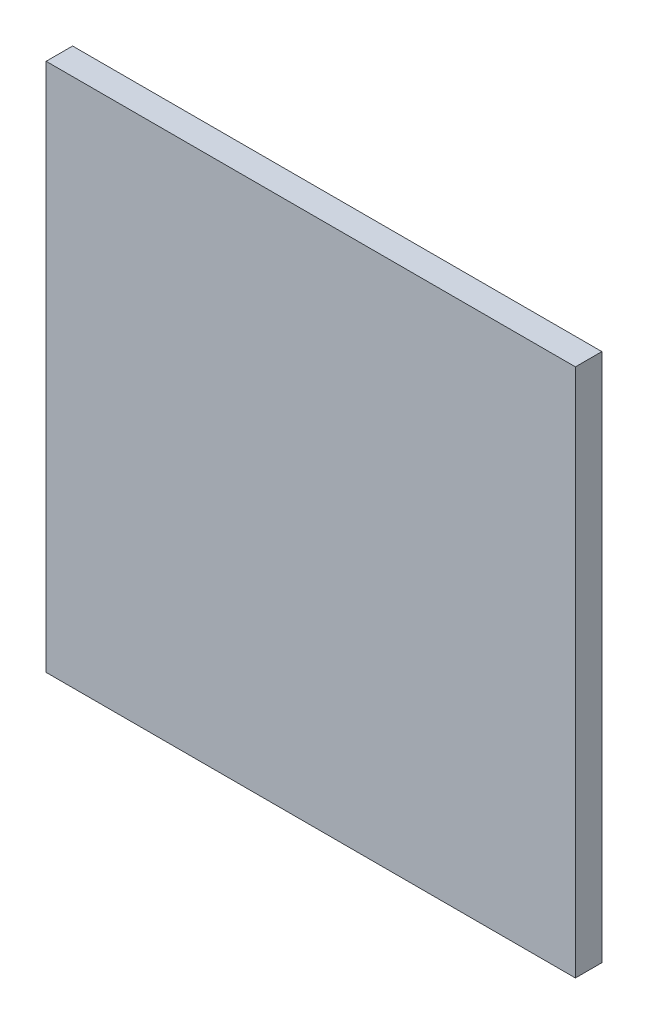
ISO-10303-21;
HEADER;
FILE_DESCRIPTION(('STEP AP214'),'2;1');
FILE_NAME('part.step','',(''),(''),'','','');
FILE_SCHEMA(('AUTOMOTIVE_DESIGN { 1 0 10303 214 1 1 1 1 }'));
ENDSEC;
DATA;
#1=APPLICATION_CONTEXT('core data for automotive mechanical design processes');
#2=APPLICATION_PROTOCOL_DEFINITION('international standard','automotive_design',2000,#1);
#3=PRODUCT_CONTEXT('',#1,'mechanical');
#4=PRODUCT('Part','Part','',(#3));
#5=PRODUCT_RELATED_PRODUCT_CATEGORY('part','',(#4));
#6=PRODUCT_DEFINITION_FORMATION('','',#4);
#7=PRODUCT_DEFINITION_CONTEXT('part definition',#1,'design');
#8=PRODUCT_DEFINITION('design','',#6,#7);
#9=PRODUCT_DEFINITION_SHAPE('','',#8);
#10=(LENGTH_UNIT() NAMED_UNIT(*) SI_UNIT(.MILLI.,.METRE.));
#11=(NAMED_UNIT(*) PLANE_ANGLE_UNIT() SI_UNIT($,.RADIAN.));
#12=(NAMED_UNIT(*) SI_UNIT($,.STERADIAN.) SOLID_ANGLE_UNIT());
#13=UNCERTAINTY_MEASURE_WITH_UNIT(LENGTH_MEASURE(1.E-05),#10,'distance_accuracy_value','');
#14=(GEOMETRIC_REPRESENTATION_CONTEXT(3) GLOBAL_UNCERTAINTY_ASSIGNED_CONTEXT((#13)) GLOBAL_UNIT_ASSIGNED_CONTEXT((#10,
#11,#12)) REPRESENTATION_CONTEXT('',''));
#15=CARTESIAN_POINT('',(0.,0.,0.));
#16=DIRECTION('',(0.,0.,1.));
#17=DIRECTION('',(1.,0.,0.));
#18=AXIS2_PLACEMENT_3D('',#15,#16,#17);
#19=CARTESIAN_POINT('',(0.,0.,0.5));
#20=DIRECTION('',(0.,0.,1.));
#21=DIRECTION('',(1.,0.,0.));
#22=AXIS2_PLACEMENT_3D('',#19,#20,#21);
#23=PLANE('',#22);
#24=DIRECTION('',(0.,-1.,0.));
#25=VECTOR('',#24,1.);
#26=CARTESIAN_POINT('',(-5.,5.,0.5));
#27=LINE('',#26,#25);
#28=CARTESIAN_POINT('',(-5.,5.,0.5));
#29=VERTEX_POINT('',#28);
#30=CARTESIAN_POINT('',(-5.,-5.,0.5));
#31=VERTEX_POINT('',#30);
#32=EDGE_CURVE('E11',#29,#31,#27,.T.);
#33=ORIENTED_EDGE('',*,*,#32,.T.);
#34=DIRECTION('',(1.,0.,0.));
#35=VECTOR('',#34,1.);
#36=CARTESIAN_POINT('',(-5.,-5.,0.5));
#37=LINE('',#36,#35);
#38=CARTESIAN_POINT('',(5.,-5.,0.5));
#39=VERTEX_POINT('',#38);
#40=EDGE_CURVE('E66',#31,#39,#37,.T.);
#41=ORIENTED_EDGE('',*,*,#40,.T.);
#42=DIRECTION('',(0.,1.,0.));
#43=VECTOR('',#42,1.);
#44=CARTESIAN_POINT('',(5.,-5.,0.5));
#45=LINE('',#44,#43);
#46=CARTESIAN_POINT('',(5.,5.,0.5));
#47=VERTEX_POINT('',#46);
#48=EDGE_CURVE('E60',#39,#47,#45,.T.);
#49=ORIENTED_EDGE('',*,*,#48,.T.);
#50=DIRECTION('',(-1.,0.,0.));
#51=VECTOR('',#50,1.);
#52=CARTESIAN_POINT('',(5.,5.,0.5));
#53=LINE('',#52,#51);
#54=EDGE_CURVE('E63',#47,#29,#53,.T.);
#55=ORIENTED_EDGE('',*,*,#54,.T.);
#56=EDGE_LOOP('',(#33,#41,#49,#55));
#57=FACE_BOUND('',#56,.T.);
#58=ADVANCED_FACE('F17',(#57),#23,.T.);
#59=CARTESIAN_POINT('',(-5.,5.,0.));
#60=DIRECTION('',(-1.,0.,0.));
#61=DIRECTION('',(0.,0.,1.));
#62=AXIS2_PLACEMENT_3D('',#59,#60,#61);
#63=PLANE('',#62);
#64=DIRECTION('',(0.,0.,1.));
#65=VECTOR('',#64,1.);
#66=CARTESIAN_POINT('',(-5.,-5.,0.));
#67=LINE('',#66,#65);
#68=CARTESIAN_POINT('',(-5.,-5.,0.));
#69=VERTEX_POINT('',#68);
#70=EDGE_CURVE('E21',#69,#31,#67,.T.);
#71=ORIENTED_EDGE('',*,*,#70,.T.);
#72=ORIENTED_EDGE('',*,*,#32,.F.);
#73=DIRECTION('',(0.,0.,1.));
#74=VECTOR('',#73,1.);
#75=CARTESIAN_POINT('',(-5.,5.,0.));
#76=LINE('',#75,#74);
#77=CARTESIAN_POINT('',(-5.,5.,0.));
#78=VERTEX_POINT('',#77);
#79=EDGE_CURVE('E85',#78,#29,#76,.T.);
#80=ORIENTED_EDGE('',*,*,#79,.F.);
#81=DIRECTION('',(0.,-1.,0.));
#82=VECTOR('',#81,1.);
#83=CARTESIAN_POINT('',(-5.,5.,0.));
#84=LINE('',#83,#82);
#85=EDGE_CURVE('E99',#78,#69,#84,.T.);
#86=ORIENTED_EDGE('',*,*,#85,.T.);
#87=EDGE_LOOP('',(#71,#72,#80,#86));
#88=FACE_BOUND('',#87,.T.);
#89=ADVANCED_FACE('F19',(#88),#63,.T.);
#90=CARTESIAN_POINT('',(-5.,-5.,0.));
#91=DIRECTION('',(0.,-1.,0.));
#92=DIRECTION('',(0.,0.,-1.));
#93=AXIS2_PLACEMENT_3D('',#90,#91,#92);
#94=PLANE('',#93);
#95=DIRECTION('',(0.,0.,1.));
#96=VECTOR('',#95,1.);
#97=CARTESIAN_POINT('',(5.,-5.,0.));
#98=LINE('',#97,#96);
#99=CARTESIAN_POINT('',(5.,-5.,0.));
#100=VERTEX_POINT('',#99);
#101=EDGE_CURVE('E71',#100,#39,#98,.T.);
#102=ORIENTED_EDGE('',*,*,#101,.T.);
#103=ORIENTED_EDGE('',*,*,#40,.F.);
#104=ORIENTED_EDGE('',*,*,#70,.F.);
#105=DIRECTION('',(1.,0.,0.));
#106=VECTOR('',#105,1.);
#107=CARTESIAN_POINT('',(-5.,-5.,0.));
#108=LINE('',#107,#106);
#109=EDGE_CURVE('E95',#69,#100,#108,.T.);
#110=ORIENTED_EDGE('',*,*,#109,.T.);
#111=EDGE_LOOP('',(#102,#103,#104,#110));
#112=FACE_BOUND('',#111,.T.);
#113=ADVANCED_FACE('F115',(#112),#94,.T.);
#114=CARTESIAN_POINT('',(5.,-5.,0.));
#115=DIRECTION('',(1.,0.,0.));
#116=DIRECTION('',(0.,1.,0.));
#117=AXIS2_PLACEMENT_3D('',#114,#115,#116);
#118=PLANE('',#117);
#119=DIRECTION('',(0.,0.,1.));
#120=VECTOR('',#119,1.);
#121=CARTESIAN_POINT('',(5.,5.,0.));
#122=LINE('',#121,#120);
#123=CARTESIAN_POINT('',(5.,5.,0.));
#124=VERTEX_POINT('',#123);
#125=EDGE_CURVE('E72',#124,#47,#122,.T.);
#126=ORIENTED_EDGE('',*,*,#125,.T.);
#127=ORIENTED_EDGE('',*,*,#48,.F.);
#128=ORIENTED_EDGE('',*,*,#101,.F.);
#129=DIRECTION('',(0.,1.,0.));
#130=VECTOR('',#129,1.);
#131=CARTESIAN_POINT('',(5.,-5.,0.));
#132=LINE('',#131,#130);
#133=EDGE_CURVE('E78',#100,#124,#132,.T.);
#134=ORIENTED_EDGE('',*,*,#133,.T.);
#135=EDGE_LOOP('',(#126,#127,#128,#134));
#136=FACE_BOUND('',#135,.T.);
#137=ADVANCED_FACE('F76',(#136),#118,.T.);
#138=CARTESIAN_POINT('',(5.,5.,0.));
#139=DIRECTION('',(0.,1.,0.));
#140=DIRECTION('',(1.,0.,0.));
#141=AXIS2_PLACEMENT_3D('',#138,#139,#140);
#142=PLANE('',#141);
#143=ORIENTED_EDGE('',*,*,#79,.T.);
#144=ORIENTED_EDGE('',*,*,#54,.F.);
#145=ORIENTED_EDGE('',*,*,#125,.F.);
#146=DIRECTION('',(-1.,0.,0.));
#147=VECTOR('',#146,1.);
#148=CARTESIAN_POINT('',(5.,5.,0.));
#149=LINE('',#148,#147);
#150=EDGE_CURVE('E91',#124,#78,#149,.T.);
#151=ORIENTED_EDGE('',*,*,#150,.T.);
#152=EDGE_LOOP('',(#143,#144,#145,#151));
#153=FACE_BOUND('',#152,.T.);
#154=ADVANCED_FACE('F84',(#153),#142,.T.);
#155=CARTESIAN_POINT('',(0.,0.,0.));
#156=DIRECTION('',(0.,0.,1.));
#157=DIRECTION('',(1.,0.,0.));
#158=AXIS2_PLACEMENT_3D('',#155,#156,#157);
#159=PLANE('',#158);
#160=ORIENTED_EDGE('',*,*,#133,.F.);
#161=ORIENTED_EDGE('',*,*,#109,.F.);
#162=ORIENTED_EDGE('',*,*,#85,.F.);
#163=ORIENTED_EDGE('',*,*,#150,.F.);
#164=EDGE_LOOP('',(#160,#161,#162,#163));
#165=FACE_BOUND('',#164,.T.);
#166=ADVANCED_FACE('F152',(#165),#159,.F.);
#167=CLOSED_SHELL('',(#58,#89,#113,#137,#154,#166));
#168=MANIFOLD_SOLID_BREP('B1',#167);
#169=ADVANCED_BREP_SHAPE_REPRESENTATION('',(#18,#168),#14);
#170=SHAPE_DEFINITION_REPRESENTATION(#9,#169);
ENDSEC;
END-ISO-10303-21;
